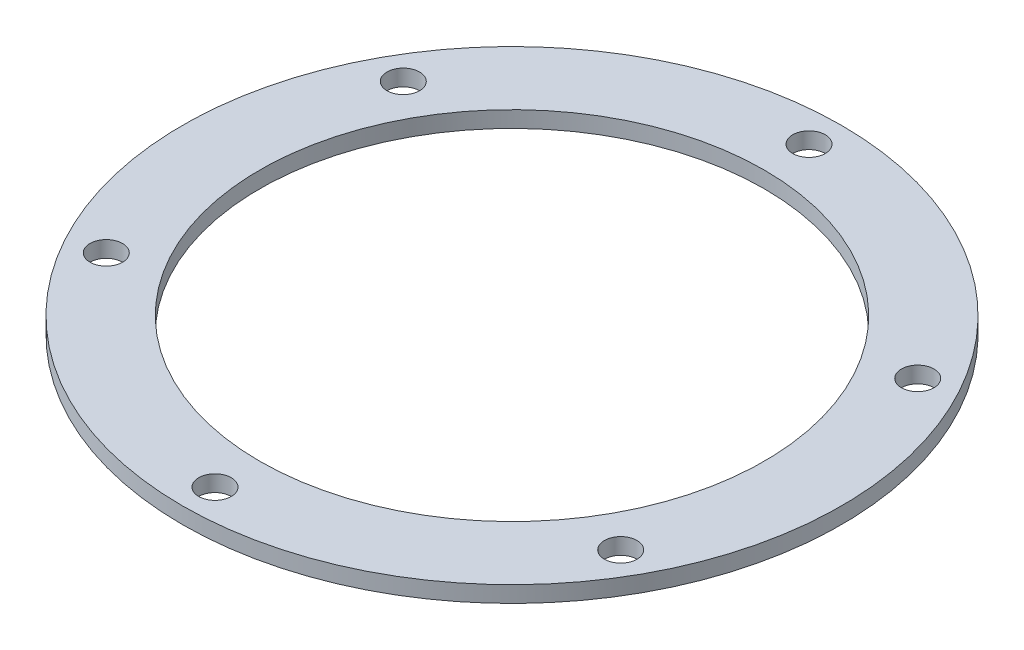
ISO-10303-21;
HEADER;
FILE_DESCRIPTION(('STEP AP214'),'2;1');
FILE_NAME('part.step','',(''),(''),'','','');
FILE_SCHEMA(('AUTOMOTIVE_DESIGN { 1 0 10303 214 1 1 1 1 }'));
ENDSEC;
DATA;
#1=APPLICATION_CONTEXT('core data for automotive mechanical design processes');
#2=APPLICATION_PROTOCOL_DEFINITION('international standard','automotive_design',2000,#1);
#3=PRODUCT_CONTEXT('',#1,'mechanical');
#4=PRODUCT('Part','Part','',(#3));
#5=PRODUCT_RELATED_PRODUCT_CATEGORY('part','',(#4));
#6=PRODUCT_DEFINITION_FORMATION('','',#4);
#7=PRODUCT_DEFINITION_CONTEXT('part definition',#1,'design');
#8=PRODUCT_DEFINITION('design','',#6,#7);
#9=PRODUCT_DEFINITION_SHAPE('','',#8);
#10=(LENGTH_UNIT() NAMED_UNIT(*) SI_UNIT(.MILLI.,.METRE.));
#11=(NAMED_UNIT(*) PLANE_ANGLE_UNIT() SI_UNIT($,.RADIAN.));
#12=(NAMED_UNIT(*) SI_UNIT($,.STERADIAN.) SOLID_ANGLE_UNIT());
#13=UNCERTAINTY_MEASURE_WITH_UNIT(LENGTH_MEASURE(1.E-05),#10,'distance_accuracy_value','');
#14=(GEOMETRIC_REPRESENTATION_CONTEXT(3) GLOBAL_UNCERTAINTY_ASSIGNED_CONTEXT((#13)) GLOBAL_UNIT_ASSIGNED_CONTEXT((#10,
#11,#12)) REPRESENTATION_CONTEXT('',''));
#15=CARTESIAN_POINT('',(0.,0.,0.));
#16=DIRECTION('',(0.,0.,1.));
#17=DIRECTION('',(1.,0.,0.));
#18=AXIS2_PLACEMENT_3D('',#15,#16,#17);
#19=CARTESIAN_POINT('',(0.,-1.,0.));
#20=DIRECTION('',(0.,1.,0.));
#21=DIRECTION('',(0.,0.,1.));
#22=AXIS2_PLACEMENT_3D('',#19,#20,#21);
#23=CYLINDRICAL_SURFACE('',#22,40.5);
#24=CARTESIAN_POINT('',(0.,-1.,0.));
#25=DIRECTION('',(0.,1.,0.));
#26=DIRECTION('',(0.,0.,1.));
#27=AXIS2_PLACEMENT_3D('',#24,#25,#26);
#28=CIRCLE('',#27,40.5);
#29=CARTESIAN_POINT('',(0.,-1.,40.5));
#30=VERTEX_POINT('',#29);
#31=EDGE_CURVE('E10',#30,#30,#28,.T.);
#32=ORIENTED_EDGE('',*,*,#31,.T.);
#33=EDGE_LOOP('',(#32));
#34=FACE_BOUND('',#33,.T.);
#35=CARTESIAN_POINT('',(0.,1.,0.));
#36=DIRECTION('',(0.,1.,0.));
#37=DIRECTION('',(0.,0.,1.));
#38=AXIS2_PLACEMENT_3D('',#35,#36,#37);
#39=CIRCLE('',#38,40.5);
#40=CARTESIAN_POINT('',(0.,1.,40.5));
#41=VERTEX_POINT('',#40);
#42=EDGE_CURVE('E40',#41,#41,#39,.T.);
#43=ORIENTED_EDGE('',*,*,#42,.F.);
#44=EDGE_LOOP('',(#43));
#45=FACE_BOUND('',#44,.T.);
#46=ADVANCED_FACE('F37',(#34,#45),#23,.T.);
#47=CARTESIAN_POINT('',(0.,-1.,0.));
#48=DIRECTION('',(0.,1.,0.));
#49=DIRECTION('',(0.,0.,1.));
#50=AXIS2_PLACEMENT_3D('',#47,#48,#49);
#51=PLANE('',#50);
#52=CARTESIAN_POINT('',(-31.609927238132,-1.,-18.25));
#53=DIRECTION('',(0.,1.,0.));
#54=DIRECTION('',(0.,0.,1.));
#55=AXIS2_PLACEMENT_3D('',#52,#53,#54);
#56=CIRCLE('',#55,2.);
#57=CARTESIAN_POINT('',(-31.609927238132,-1.,-16.25));
#58=VERTEX_POINT('',#57);
#59=EDGE_CURVE('E82',#58,#58,#56,.T.);
#60=ORIENTED_EDGE('',*,*,#59,.T.);
#61=EDGE_LOOP('',(#60));
#62=FACE_BOUND('',#61,.T.);
#63=CARTESIAN_POINT('',(-31.609927238132,-1.,18.25));
#64=DIRECTION('',(0.,1.,0.));
#65=DIRECTION('',(0.,0.,1.));
#66=AXIS2_PLACEMENT_3D('',#63,#64,#65);
#67=CIRCLE('',#66,2.);
#68=CARTESIAN_POINT('',(-31.609927238132,-1.,20.25));
#69=VERTEX_POINT('',#68);
#70=EDGE_CURVE('E76',#69,#69,#67,.T.);
#71=ORIENTED_EDGE('',*,*,#70,.T.);
#72=EDGE_LOOP('',(#71));
#73=FACE_BOUND('',#72,.T.);
#74=CARTESIAN_POINT('',(0.,-1.,36.5));
#75=DIRECTION('',(0.,1.,0.));
#76=DIRECTION('',(0.,0.,1.));
#77=AXIS2_PLACEMENT_3D('',#74,#75,#76);
#78=CIRCLE('',#77,2.);
#79=CARTESIAN_POINT('',(0.,-1.,38.5));
#80=VERTEX_POINT('',#79);
#81=EDGE_CURVE('E70',#80,#80,#78,.T.);
#82=ORIENTED_EDGE('',*,*,#81,.T.);
#83=EDGE_LOOP('',(#82));
#84=FACE_BOUND('',#83,.T.);
#85=CARTESIAN_POINT('',(31.609927238132,-1.,18.25));
#86=DIRECTION('',(0.,1.,0.));
#87=DIRECTION('',(0.,0.,1.));
#88=AXIS2_PLACEMENT_3D('',#85,#86,#87);
#89=CIRCLE('',#88,2.);
#90=CARTESIAN_POINT('',(31.609927238132,-1.,20.25));
#91=VERTEX_POINT('',#90);
#92=EDGE_CURVE('E64',#91,#91,#89,.T.);
#93=ORIENTED_EDGE('',*,*,#92,.T.);
#94=EDGE_LOOP('',(#93));
#95=FACE_BOUND('',#94,.T.);
#96=CARTESIAN_POINT('',(31.609927238132,-1.,-18.25));
#97=DIRECTION('',(0.,1.,0.));
#98=DIRECTION('',(0.,0.,1.));
#99=AXIS2_PLACEMENT_3D('',#96,#97,#98);
#100=CIRCLE('',#99,2.);
#101=CARTESIAN_POINT('',(31.609927238132,-1.,-16.25));
#102=VERTEX_POINT('',#101);
#103=EDGE_CURVE('E58',#102,#102,#100,.T.);
#104=ORIENTED_EDGE('',*,*,#103,.T.);
#105=EDGE_LOOP('',(#104));
#106=FACE_BOUND('',#105,.T.);
#107=CARTESIAN_POINT('',(0.,-1.,-36.5));
#108=DIRECTION('',(0.,1.,0.));
#109=DIRECTION('',(0.,0.,1.));
#110=AXIS2_PLACEMENT_3D('',#107,#108,#109);
#111=CIRCLE('',#110,2.);
#112=CARTESIAN_POINT('',(0.,-1.,-34.5));
#113=VERTEX_POINT('',#112);
#114=EDGE_CURVE('E52',#113,#113,#111,.T.);
#115=ORIENTED_EDGE('',*,*,#114,.T.);
#116=EDGE_LOOP('',(#115));
#117=FACE_BOUND('',#116,.T.);
#118=CARTESIAN_POINT('',(0.,-1.,0.));
#119=DIRECTION('',(0.,1.,0.));
#120=DIRECTION('',(0.,0.,1.));
#121=AXIS2_PLACEMENT_3D('',#118,#119,#120);
#122=CIRCLE('',#121,31.);
#123=CARTESIAN_POINT('',(0.,-1.,31.));
#124=VERTEX_POINT('',#123);
#125=EDGE_CURVE('E47',#124,#124,#122,.T.);
#126=ORIENTED_EDGE('',*,*,#125,.T.);
#127=EDGE_LOOP('',(#126));
#128=FACE_BOUND('',#127,.T.);
#129=ORIENTED_EDGE('',*,*,#31,.F.);
#130=EDGE_LOOP('',(#129));
#131=FACE_BOUND('',#130,.T.);
#132=ADVANCED_FACE('F91',(#62,#73,#84,#95,#106,#117,#128,#131),#51,.F.);
#133=CARTESIAN_POINT('',(0.,1.,0.));
#134=DIRECTION('',(0.,1.,0.));
#135=DIRECTION('',(0.,0.,1.));
#136=AXIS2_PLACEMENT_3D('',#133,#134,#135);
#137=PLANE('',#136);
#138=CARTESIAN_POINT('',(-31.609927238132,1.,-18.25));
#139=DIRECTION('',(0.,1.,0.));
#140=DIRECTION('',(0.,0.,1.));
#141=AXIS2_PLACEMENT_3D('',#138,#139,#140);
#142=CIRCLE('',#141,2.);
#143=CARTESIAN_POINT('',(-31.609927238132,1.,-16.25));
#144=VERTEX_POINT('',#143);
#145=EDGE_CURVE('E85',#144,#144,#142,.T.);
#146=ORIENTED_EDGE('',*,*,#145,.F.);
#147=EDGE_LOOP('',(#146));
#148=FACE_BOUND('',#147,.T.);
#149=CARTESIAN_POINT('',(-31.609927238132,1.,18.25));
#150=DIRECTION('',(0.,1.,0.));
#151=DIRECTION('',(0.,0.,1.));
#152=AXIS2_PLACEMENT_3D('',#149,#150,#151);
#153=CIRCLE('',#152,2.);
#154=CARTESIAN_POINT('',(-31.609927238132,1.,20.25));
#155=VERTEX_POINT('',#154);
#156=EDGE_CURVE('E79',#155,#155,#153,.T.);
#157=ORIENTED_EDGE('',*,*,#156,.F.);
#158=EDGE_LOOP('',(#157));
#159=FACE_BOUND('',#158,.T.);
#160=CARTESIAN_POINT('',(0.,1.,36.5));
#161=DIRECTION('',(0.,1.,0.));
#162=DIRECTION('',(0.,0.,1.));
#163=AXIS2_PLACEMENT_3D('',#160,#161,#162);
#164=CIRCLE('',#163,2.);
#165=CARTESIAN_POINT('',(0.,1.,38.5));
#166=VERTEX_POINT('',#165);
#167=EDGE_CURVE('E73',#166,#166,#164,.T.);
#168=ORIENTED_EDGE('',*,*,#167,.F.);
#169=EDGE_LOOP('',(#168));
#170=FACE_BOUND('',#169,.T.);
#171=CARTESIAN_POINT('',(31.609927238132,1.,18.25));
#172=DIRECTION('',(0.,1.,0.));
#173=DIRECTION('',(0.,0.,1.));
#174=AXIS2_PLACEMENT_3D('',#171,#172,#173);
#175=CIRCLE('',#174,2.);
#176=CARTESIAN_POINT('',(31.609927238132,1.,20.25));
#177=VERTEX_POINT('',#176);
#178=EDGE_CURVE('E67',#177,#177,#175,.T.);
#179=ORIENTED_EDGE('',*,*,#178,.F.);
#180=EDGE_LOOP('',(#179));
#181=FACE_BOUND('',#180,.T.);
#182=CARTESIAN_POINT('',(31.609927238132,1.,-18.25));
#183=DIRECTION('',(0.,1.,0.));
#184=DIRECTION('',(0.,0.,1.));
#185=AXIS2_PLACEMENT_3D('',#182,#183,#184);
#186=CIRCLE('',#185,2.);
#187=CARTESIAN_POINT('',(31.609927238132,1.,-16.25));
#188=VERTEX_POINT('',#187);
#189=EDGE_CURVE('E61',#188,#188,#186,.T.);
#190=ORIENTED_EDGE('',*,*,#189,.F.);
#191=EDGE_LOOP('',(#190));
#192=FACE_BOUND('',#191,.T.);
#193=CARTESIAN_POINT('',(0.,1.,-36.5));
#194=DIRECTION('',(0.,1.,0.));
#195=DIRECTION('',(0.,0.,1.));
#196=AXIS2_PLACEMENT_3D('',#193,#194,#195);
#197=CIRCLE('',#196,2.);
#198=CARTESIAN_POINT('',(0.,1.,-34.5));
#199=VERTEX_POINT('',#198);
#200=EDGE_CURVE('E55',#199,#199,#197,.T.);
#201=ORIENTED_EDGE('',*,*,#200,.F.);
#202=EDGE_LOOP('',(#201));
#203=FACE_BOUND('',#202,.T.);
#204=CARTESIAN_POINT('',(0.,1.,0.));
#205=DIRECTION('',(0.,1.,0.));
#206=DIRECTION('',(0.,0.,1.));
#207=AXIS2_PLACEMENT_3D('',#204,#205,#206);
#208=CIRCLE('',#207,31.);
#209=CARTESIAN_POINT('',(0.,1.,31.));
#210=VERTEX_POINT('',#209);
#211=EDGE_CURVE('E49',#210,#210,#208,.T.);
#212=ORIENTED_EDGE('',*,*,#211,.F.);
#213=EDGE_LOOP('',(#212));
#214=FACE_BOUND('',#213,.T.);
#215=ORIENTED_EDGE('',*,*,#42,.T.);
#216=EDGE_LOOP('',(#215));
#217=FACE_BOUND('',#216,.T.);
#218=ADVANCED_FACE('F101',(#148,#159,#170,#181,#192,#203,#214,#217),#137,.T.);
#219=CARTESIAN_POINT('',(0.,-1.,0.));
#220=DIRECTION('',(0.,1.,0.));
#221=DIRECTION('',(0.,0.,1.));
#222=AXIS2_PLACEMENT_3D('',#219,#220,#221);
#223=CYLINDRICAL_SURFACE('',#222,31.);
#224=ORIENTED_EDGE('',*,*,#125,.F.);
#225=EDGE_LOOP('',(#224));
#226=FACE_BOUND('',#225,.T.);
#227=ORIENTED_EDGE('',*,*,#211,.T.);
#228=EDGE_LOOP('',(#227));
#229=FACE_BOUND('',#228,.T.);
#230=ADVANCED_FACE('F104',(#226,#229),#223,.F.);
#231=CARTESIAN_POINT('',(0.,-1.,-36.5));
#232=DIRECTION('',(0.,1.,0.));
#233=DIRECTION('',(0.,0.,1.));
#234=AXIS2_PLACEMENT_3D('',#231,#232,#233);
#235=CYLINDRICAL_SURFACE('',#234,2.);
#236=ORIENTED_EDGE('',*,*,#114,.F.);
#237=EDGE_LOOP('',(#236));
#238=FACE_BOUND('',#237,.T.);
#239=ORIENTED_EDGE('',*,*,#200,.T.);
#240=EDGE_LOOP('',(#239));
#241=FACE_BOUND('',#240,.T.);
#242=ADVANCED_FACE('F129',(#238,#241),#235,.F.);
#243=CARTESIAN_POINT('',(31.609927238132,-1.,-18.25));
#244=DIRECTION('',(0.,1.,0.));
#245=DIRECTION('',(0.,0.,1.));
#246=AXIS2_PLACEMENT_3D('',#243,#244,#245);
#247=CYLINDRICAL_SURFACE('',#246,2.);
#248=ORIENTED_EDGE('',*,*,#103,.F.);
#249=EDGE_LOOP('',(#248));
#250=FACE_BOUND('',#249,.T.);
#251=ORIENTED_EDGE('',*,*,#189,.T.);
#252=EDGE_LOOP('',(#251));
#253=FACE_BOUND('',#252,.T.);
#254=ADVANCED_FACE('F133',(#250,#253),#247,.F.);
#255=CARTESIAN_POINT('',(31.609927238132,-1.,18.25));
#256=DIRECTION('',(0.,1.,0.));
#257=DIRECTION('',(0.,0.,1.));
#258=AXIS2_PLACEMENT_3D('',#255,#256,#257);
#259=CYLINDRICAL_SURFACE('',#258,2.);
#260=ORIENTED_EDGE('',*,*,#92,.F.);
#261=EDGE_LOOP('',(#260));
#262=FACE_BOUND('',#261,.T.);
#263=ORIENTED_EDGE('',*,*,#178,.T.);
#264=EDGE_LOOP('',(#263));
#265=FACE_BOUND('',#264,.T.);
#266=ADVANCED_FACE('F137',(#262,#265),#259,.F.);
#267=CARTESIAN_POINT('',(0.,-1.,36.5));
#268=DIRECTION('',(0.,1.,0.));
#269=DIRECTION('',(0.,0.,1.));
#270=AXIS2_PLACEMENT_3D('',#267,#268,#269);
#271=CYLINDRICAL_SURFACE('',#270,2.);
#272=ORIENTED_EDGE('',*,*,#81,.F.);
#273=EDGE_LOOP('',(#272));
#274=FACE_BOUND('',#273,.T.);
#275=ORIENTED_EDGE('',*,*,#167,.T.);
#276=EDGE_LOOP('',(#275));
#277=FACE_BOUND('',#276,.T.);
#278=ADVANCED_FACE('F141',(#274,#277),#271,.F.);
#279=CARTESIAN_POINT('',(-31.609927238132,-1.,18.25));
#280=DIRECTION('',(0.,1.,0.));
#281=DIRECTION('',(0.,0.,1.));
#282=AXIS2_PLACEMENT_3D('',#279,#280,#281);
#283=CYLINDRICAL_SURFACE('',#282,2.);
#284=ORIENTED_EDGE('',*,*,#70,.F.);
#285=EDGE_LOOP('',(#284));
#286=FACE_BOUND('',#285,.T.);
#287=ORIENTED_EDGE('',*,*,#156,.T.);
#288=EDGE_LOOP('',(#287));
#289=FACE_BOUND('',#288,.T.);
#290=ADVANCED_FACE('F97',(#286,#289),#283,.F.);
#291=CARTESIAN_POINT('',(-31.609927238132,-1.,-18.25));
#292=DIRECTION('',(0.,1.,0.));
#293=DIRECTION('',(0.,0.,1.));
#294=AXIS2_PLACEMENT_3D('',#291,#292,#293);
#295=CYLINDRICAL_SURFACE('',#294,2.);
#296=ORIENTED_EDGE('',*,*,#59,.F.);
#297=EDGE_LOOP('',(#296));
#298=FACE_BOUND('',#297,.T.);
#299=ORIENTED_EDGE('',*,*,#145,.T.);
#300=EDGE_LOOP('',(#299));
#301=FACE_BOUND('',#300,.T.);
#302=ADVANCED_FACE('F94',(#298,#301),#295,.F.);
#303=CLOSED_SHELL('',(#46,#132,#218,#230,#242,#254,#266,#278,#290,#302));
#304=MANIFOLD_SOLID_BREP('B2',#303);
#305=ADVANCED_BREP_SHAPE_REPRESENTATION('',(#18,#304),#14);
#306=SHAPE_DEFINITION_REPRESENTATION(#9,#305);
ENDSEC;
END-ISO-10303-21;
